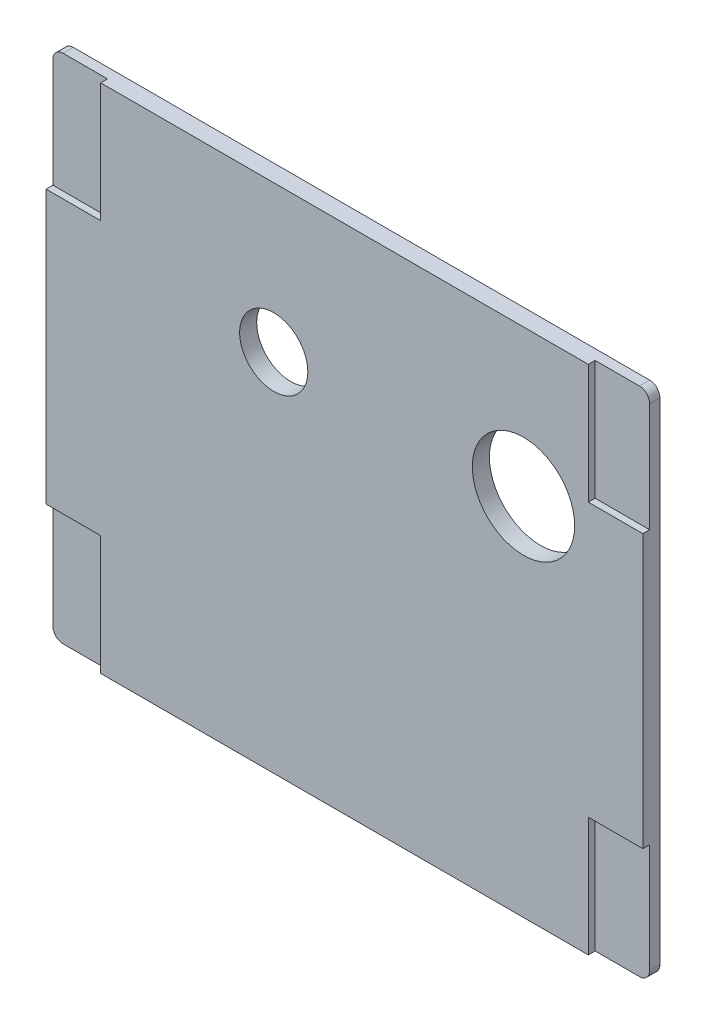
ISO-10303-21;
HEADER;
FILE_DESCRIPTION(('STEP AP214'),'2;1');
FILE_NAME('part.step','',(''),(''),'','','');
FILE_SCHEMA(('AUTOMOTIVE_DESIGN { 1 0 10303 214 1 1 1 1 }'));
ENDSEC;
DATA;
#1=APPLICATION_CONTEXT('core data for automotive mechanical design processes');
#2=APPLICATION_PROTOCOL_DEFINITION('international standard','automotive_design',2000,#1);
#3=PRODUCT_CONTEXT('',#1,'mechanical');
#4=PRODUCT('Part','Part','',(#3));
#5=PRODUCT_RELATED_PRODUCT_CATEGORY('part','',(#4));
#6=PRODUCT_DEFINITION_FORMATION('','',#4);
#7=PRODUCT_DEFINITION_CONTEXT('part definition',#1,'design');
#8=PRODUCT_DEFINITION('design','',#6,#7);
#9=PRODUCT_DEFINITION_SHAPE('','',#8);
#10=(LENGTH_UNIT() NAMED_UNIT(*) SI_UNIT(.MILLI.,.METRE.));
#11=(NAMED_UNIT(*) PLANE_ANGLE_UNIT() SI_UNIT($,.RADIAN.));
#12=(NAMED_UNIT(*) SI_UNIT($,.STERADIAN.) SOLID_ANGLE_UNIT());
#13=UNCERTAINTY_MEASURE_WITH_UNIT(LENGTH_MEASURE(1.E-05),#10,'distance_accuracy_value','');
#14=(GEOMETRIC_REPRESENTATION_CONTEXT(3) GLOBAL_UNCERTAINTY_ASSIGNED_CONTEXT((#13)) GLOBAL_UNIT_ASSIGNED_CONTEXT((#10,
#11,#12)) REPRESENTATION_CONTEXT('',''));
#15=CARTESIAN_POINT('',(0.,0.,0.));
#16=DIRECTION('',(0.,0.,1.));
#17=DIRECTION('',(1.,0.,0.));
#18=AXIS2_PLACEMENT_3D('',#15,#16,#17);
#19=CARTESIAN_POINT('',(0.,0.,5.));
#20=DIRECTION('',(-1.,0.,0.));
#21=DIRECTION('',(0.,-1.,0.));
#22=AXIS2_PLACEMENT_3D('',#19,#20,#21);
#23=PLANE('',#22);
#24=DIRECTION('',(0.,1.,0.));
#25=VECTOR('',#24,1.);
#26=CARTESIAN_POINT('',(0.,-150.,3.));
#27=LINE('',#26,#25);
#28=CARTESIAN_POINT('',(0.,-147.,3.));
#29=VERTEX_POINT('',#28);
#30=CARTESIAN_POINT('',(0.,-115.,3.));
#31=VERTEX_POINT('',#30);
#32=EDGE_CURVE('E204',#29,#31,#27,.T.);
#33=ORIENTED_EDGE('',*,*,#32,.F.);
#34=DIRECTION('',(0.,0.,-1.));
#35=VECTOR('',#34,1.);
#36=CARTESIAN_POINT('',(0.,-147.,5.));
#37=LINE('',#36,#35);
#38=CARTESIAN_POINT('',(0.,-147.,0.));
#39=VERTEX_POINT('',#38);
#40=EDGE_CURVE('E331',#29,#39,#37,.T.);
#41=ORIENTED_EDGE('',*,*,#40,.T.);
#42=DIRECTION('',(0.,1.,0.));
#43=VECTOR('',#42,1.);
#44=CARTESIAN_POINT('',(0.,0.,0.));
#45=LINE('',#44,#43);
#46=CARTESIAN_POINT('',(0.,-3.,0.));
#47=VERTEX_POINT('',#46);
#48=EDGE_CURVE('E280',#39,#47,#45,.T.);
#49=ORIENTED_EDGE('',*,*,#48,.T.);
#50=DIRECTION('',(0.,0.,-1.));
#51=VECTOR('',#50,1.);
#52=CARTESIAN_POINT('',(0.,-3.,5.));
#53=LINE('',#52,#51);
#54=CARTESIAN_POINT('',(0.,-3.,3.));
#55=VERTEX_POINT('',#54);
#56=EDGE_CURVE('E48',#47,#55,#53,.F.);
#57=ORIENTED_EDGE('',*,*,#56,.T.);
#58=DIRECTION('',(0.,1.,0.));
#59=VECTOR('',#58,1.);
#60=CARTESIAN_POINT('',(0.,0.,3.));
#61=LINE('',#60,#59);
#62=CARTESIAN_POINT('',(0.,-35.,3.));
#63=VERTEX_POINT('',#62);
#64=EDGE_CURVE('E182',#63,#55,#61,.T.);
#65=ORIENTED_EDGE('',*,*,#64,.F.);
#66=DIRECTION('',(0.,0.,1.));
#67=VECTOR('',#66,1.);
#68=CARTESIAN_POINT('',(0.,-35.,3.));
#69=LINE('',#68,#67);
#70=CARTESIAN_POINT('',(0.,-35.,5.));
#71=VERTEX_POINT('',#70);
#72=EDGE_CURVE('E199',#63,#71,#69,.T.);
#73=ORIENTED_EDGE('',*,*,#72,.T.);
#74=DIRECTION('',(0.,1.,0.));
#75=VECTOR('',#74,1.);
#76=CARTESIAN_POINT('',(0.,0.,5.));
#77=LINE('',#76,#75);
#78=CARTESIAN_POINT('',(0.,-115.,5.));
#79=VERTEX_POINT('',#78);
#80=EDGE_CURVE('E285',#79,#71,#77,.T.);
#81=ORIENTED_EDGE('',*,*,#80,.F.);
#82=DIRECTION('',(0.,0.,1.));
#83=VECTOR('',#82,1.);
#84=CARTESIAN_POINT('',(0.,-115.,3.));
#85=LINE('',#84,#83);
#86=EDGE_CURVE('E215',#31,#79,#85,.T.);
#87=ORIENTED_EDGE('',*,*,#86,.F.);
#88=EDGE_LOOP('',(#33,#41,#49,#57,#65,#73,#81,#87));
#89=FACE_BOUND('',#88,.T.);
#90=ADVANCED_FACE('F33',(#89),#23,.F.);
#91=CARTESIAN_POINT('',(0.,0.,5.));
#92=DIRECTION('',(0.,-1.,0.));
#93=DIRECTION('',(1.,0.,0.));
#94=AXIS2_PLACEMENT_3D('',#91,#92,#93);
#95=PLANE('',#94);
#96=DIRECTION('',(-1.,0.,0.));
#97=VECTOR('',#96,1.);
#98=CARTESIAN_POINT('',(0.,0.,0.));
#99=LINE('',#98,#97);
#100=CARTESIAN_POINT('',(-3.,0.,0.));
#101=VERTEX_POINT('',#100);
#102=CARTESIAN_POINT('',(-172.,0.,0.));
#103=VERTEX_POINT('',#102);
#104=EDGE_CURVE('E298',#101,#103,#99,.T.);
#105=ORIENTED_EDGE('',*,*,#104,.T.);
#106=DIRECTION('',(0.,0.,-1.));
#107=VECTOR('',#106,1.);
#108=CARTESIAN_POINT('',(-172.,0.,5.));
#109=LINE('',#108,#107);
#110=CARTESIAN_POINT('',(-172.,0.,3.));
#111=VERTEX_POINT('',#110);
#112=EDGE_CURVE('E319',#103,#111,#109,.F.);
#113=ORIENTED_EDGE('',*,*,#112,.T.);
#114=DIRECTION('',(-1.,0.,0.));
#115=VECTOR('',#114,1.);
#116=CARTESIAN_POINT('',(-175.,0.,3.));
#117=LINE('',#116,#115);
#118=CARTESIAN_POINT('',(-159.,0.,3.));
#119=VERTEX_POINT('',#118);
#120=EDGE_CURVE('E259',#119,#111,#117,.T.);
#121=ORIENTED_EDGE('',*,*,#120,.F.);
#122=DIRECTION('',(0.,0.,1.));
#123=VECTOR('',#122,1.);
#124=CARTESIAN_POINT('',(-159.,0.,3.));
#125=LINE('',#124,#123);
#126=CARTESIAN_POINT('',(-159.,0.,5.));
#127=VERTEX_POINT('',#126);
#128=EDGE_CURVE('E267',#119,#127,#125,.T.);
#129=ORIENTED_EDGE('',*,*,#128,.T.);
#130=DIRECTION('',(-1.,0.,0.));
#131=VECTOR('',#130,1.);
#132=CARTESIAN_POINT('',(0.,0.,5.));
#133=LINE('',#132,#131);
#134=CARTESIAN_POINT('',(-16.,0.,5.));
#135=VERTEX_POINT('',#134);
#136=EDGE_CURVE('E197',#135,#127,#133,.T.);
#137=ORIENTED_EDGE('',*,*,#136,.F.);
#138=DIRECTION('',(0.,0.,1.));
#139=VECTOR('',#138,1.);
#140=CARTESIAN_POINT('',(-16.,0.,3.));
#141=LINE('',#140,#139);
#142=CARTESIAN_POINT('',(-16.,0.,3.));
#143=VERTEX_POINT('',#142);
#144=EDGE_CURVE('E187',#143,#135,#141,.T.);
#145=ORIENTED_EDGE('',*,*,#144,.F.);
#146=DIRECTION('',(-1.,0.,0.));
#147=VECTOR('',#146,1.);
#148=CARTESIAN_POINT('',(0.,0.,3.));
#149=LINE('',#148,#147);
#150=CARTESIAN_POINT('',(-3.,0.,3.));
#151=VERTEX_POINT('',#150);
#152=EDGE_CURVE('E171',#151,#143,#149,.T.);
#153=ORIENTED_EDGE('',*,*,#152,.F.);
#154=DIRECTION('',(0.,0.,-1.));
#155=VECTOR('',#154,1.);
#156=CARTESIAN_POINT('',(-3.,0.,5.));
#157=LINE('',#156,#155);
#158=EDGE_CURVE('E317',#151,#101,#157,.T.);
#159=ORIENTED_EDGE('',*,*,#158,.T.);
#160=EDGE_LOOP('',(#105,#113,#121,#129,#137,#145,#153,#159));
#161=FACE_BOUND('',#160,.T.);
#162=ADVANCED_FACE('F194',(#161),#95,.F.);
#163=CARTESIAN_POINT('',(-175.,0.,5.));
#164=DIRECTION('',(1.,0.,0.));
#165=DIRECTION('',(0.,0.,-1.));
#166=AXIS2_PLACEMENT_3D('',#163,#164,#165);
#167=PLANE('',#166);
#168=DIRECTION('',(0.,-1.,0.));
#169=VECTOR('',#168,1.);
#170=CARTESIAN_POINT('',(-175.,0.,3.));
#171=LINE('',#170,#169);
#172=CARTESIAN_POINT('',(-175.,-3.00000000000002,3.));
#173=VERTEX_POINT('',#172);
#174=CARTESIAN_POINT('',(-175.,-35.,3.));
#175=VERTEX_POINT('',#174);
#176=EDGE_CURVE('E250',#173,#175,#171,.T.);
#177=ORIENTED_EDGE('',*,*,#176,.F.);
#178=DIRECTION('',(0.,0.,-1.));
#179=VECTOR('',#178,1.);
#180=CARTESIAN_POINT('',(-175.,-3.00000000000002,5.));
#181=LINE('',#180,#179);
#182=CARTESIAN_POINT('',(-175.,-3.00000000000002,0.));
#183=VERTEX_POINT('',#182);
#184=EDGE_CURVE('E306',#173,#183,#181,.T.);
#185=ORIENTED_EDGE('',*,*,#184,.T.);
#186=DIRECTION('',(0.,-1.,0.));
#187=VECTOR('',#186,1.);
#188=CARTESIAN_POINT('',(-175.,0.,0.));
#189=LINE('',#188,#187);
#190=CARTESIAN_POINT('',(-175.,-147.,0.));
#191=VERTEX_POINT('',#190);
#192=EDGE_CURVE('E300',#183,#191,#189,.T.);
#193=ORIENTED_EDGE('',*,*,#192,.T.);
#194=DIRECTION('',(0.,0.,-1.));
#195=VECTOR('',#194,1.);
#196=CARTESIAN_POINT('',(-175.,-147.,5.));
#197=LINE('',#196,#195);
#198=CARTESIAN_POINT('',(-175.,-147.,3.));
#199=VERTEX_POINT('',#198);
#200=EDGE_CURVE('E296',#191,#199,#197,.F.);
#201=ORIENTED_EDGE('',*,*,#200,.T.);
#202=DIRECTION('',(0.,-1.,0.));
#203=VECTOR('',#202,1.);
#204=CARTESIAN_POINT('',(-175.,-150.,3.));
#205=LINE('',#204,#203);
#206=CARTESIAN_POINT('',(-175.,-115.,3.));
#207=VERTEX_POINT('',#206);
#208=EDGE_CURVE('E228',#207,#199,#205,.T.);
#209=ORIENTED_EDGE('',*,*,#208,.F.);
#210=DIRECTION('',(0.,0.,1.));
#211=VECTOR('',#210,1.);
#212=CARTESIAN_POINT('',(-175.,-115.,3.));
#213=LINE('',#212,#211);
#214=CARTESIAN_POINT('',(-175.,-115.,5.));
#215=VERTEX_POINT('',#214);
#216=EDGE_CURVE('E219',#207,#215,#213,.T.);
#217=ORIENTED_EDGE('',*,*,#216,.T.);
#218=DIRECTION('',(0.,-1.,0.));
#219=VECTOR('',#218,1.);
#220=CARTESIAN_POINT('',(-175.,0.,5.));
#221=LINE('',#220,#219);
#222=CARTESIAN_POINT('',(-175.,-35.,5.));
#223=VERTEX_POINT('',#222);
#224=EDGE_CURVE('E290',#223,#215,#221,.T.);
#225=ORIENTED_EDGE('',*,*,#224,.F.);
#226=DIRECTION('',(0.,0.,1.));
#227=VECTOR('',#226,1.);
#228=CARTESIAN_POINT('',(-175.,-35.,3.));
#229=LINE('',#228,#227);
#230=EDGE_CURVE('E262',#175,#223,#229,.T.);
#231=ORIENTED_EDGE('',*,*,#230,.F.);
#232=EDGE_LOOP('',(#177,#185,#193,#201,#209,#217,#225,#231));
#233=FACE_BOUND('',#232,.T.);
#234=ADVANCED_FACE('F355',(#233),#167,.F.);
#235=CARTESIAN_POINT('',(0.,-150.,5.));
#236=DIRECTION('',(0.,1.,0.));
#237=DIRECTION('',(-1.,0.,0.));
#238=AXIS2_PLACEMENT_3D('',#235,#236,#237);
#239=PLANE('',#238);
#240=DIRECTION('',(1.,0.,0.));
#241=VECTOR('',#240,1.);
#242=CARTESIAN_POINT('',(-175.,-150.,3.));
#243=LINE('',#242,#241);
#244=CARTESIAN_POINT('',(-172.,-150.,3.));
#245=VERTEX_POINT('',#244);
#246=CARTESIAN_POINT('',(-159.,-150.,3.));
#247=VERTEX_POINT('',#246);
#248=EDGE_CURVE('E231',#245,#247,#243,.T.);
#249=ORIENTED_EDGE('',*,*,#248,.F.);
#250=DIRECTION('',(0.,0.,-1.));
#251=VECTOR('',#250,1.);
#252=CARTESIAN_POINT('',(-172.,-150.,5.));
#253=LINE('',#252,#251);
#254=CARTESIAN_POINT('',(-172.,-150.,0.));
#255=VERTEX_POINT('',#254);
#256=EDGE_CURVE('E325',#245,#255,#253,.T.);
#257=ORIENTED_EDGE('',*,*,#256,.T.);
#258=DIRECTION('',(1.,0.,0.));
#259=VECTOR('',#258,1.);
#260=CARTESIAN_POINT('',(0.,-150.,0.));
#261=LINE('',#260,#259);
#262=CARTESIAN_POINT('',(-2.99999999999998,-150.,0.));
#263=VERTEX_POINT('',#262);
#264=EDGE_CURVE('E288',#255,#263,#261,.T.);
#265=ORIENTED_EDGE('',*,*,#264,.T.);
#266=DIRECTION('',(0.,0.,-1.));
#267=VECTOR('',#266,1.);
#268=CARTESIAN_POINT('',(-2.99999999999998,-150.,5.));
#269=LINE('',#268,#267);
#270=CARTESIAN_POINT('',(-2.99999999999998,-150.,3.));
#271=VERTEX_POINT('',#270);
#272=EDGE_CURVE('E323',#263,#271,#269,.F.);
#273=ORIENTED_EDGE('',*,*,#272,.T.);
#274=DIRECTION('',(1.,0.,0.));
#275=VECTOR('',#274,1.);
#276=CARTESIAN_POINT('',(0.,-150.,3.));
#277=LINE('',#276,#275);
#278=CARTESIAN_POINT('',(-16.,-150.,3.));
#279=VERTEX_POINT('',#278);
#280=EDGE_CURVE('E213',#279,#271,#277,.T.);
#281=ORIENTED_EDGE('',*,*,#280,.F.);
#282=DIRECTION('',(0.,0.,1.));
#283=VECTOR('',#282,1.);
#284=CARTESIAN_POINT('',(-16.,-150.,3.));
#285=LINE('',#284,#283);
#286=CARTESIAN_POINT('',(-16.,-150.,5.));
#287=VERTEX_POINT('',#286);
#288=EDGE_CURVE('E221',#279,#287,#285,.T.);
#289=ORIENTED_EDGE('',*,*,#288,.T.);
#290=DIRECTION('',(1.,0.,0.));
#291=VECTOR('',#290,1.);
#292=CARTESIAN_POINT('',(0.,-150.,5.));
#293=LINE('',#292,#291);
#294=CARTESIAN_POINT('',(-159.,-150.,5.));
#295=VERTEX_POINT('',#294);
#296=EDGE_CURVE('E293',#295,#287,#293,.T.);
#297=ORIENTED_EDGE('',*,*,#296,.F.);
#298=DIRECTION('',(0.,0.,1.));
#299=VECTOR('',#298,1.);
#300=CARTESIAN_POINT('',(-159.,-150.,3.));
#301=LINE('',#300,#299);
#302=EDGE_CURVE('E240',#247,#295,#301,.T.);
#303=ORIENTED_EDGE('',*,*,#302,.F.);
#304=EDGE_LOOP('',(#249,#257,#265,#273,#281,#289,#297,#303));
#305=FACE_BOUND('',#304,.T.);
#306=ADVANCED_FACE('F402',(#305),#239,.F.);
#307=CARTESIAN_POINT('',(0.,0.,5.));
#308=DIRECTION('',(0.,0.,-1.));
#309=DIRECTION('',(-1.,0.,0.));
#310=AXIS2_PLACEMENT_3D('',#307,#308,#309);
#311=PLANE('',#310);
#312=CARTESIAN_POINT('',(-35.,-43.,5.));
#313=DIRECTION('',(0.,0.,1.));
#314=DIRECTION('',(1.,0.,0.));
#315=AXIS2_PLACEMENT_3D('',#312,#313,#314);
#316=CIRCLE('',#315,15.);
#317=CARTESIAN_POINT('',(-20.,-43.,5.));
#318=VERTEX_POINT('',#317);
#319=EDGE_CURVE('E273',#318,#318,#316,.T.);
#320=ORIENTED_EDGE('',*,*,#319,.F.);
#321=EDGE_LOOP('',(#320));
#322=FACE_BOUND('',#321,.T.);
#323=CARTESIAN_POINT('',(-108.25,-43.,5.));
#324=DIRECTION('',(0.,0.,1.));
#325=DIRECTION('',(1.,0.,0.));
#326=AXIS2_PLACEMENT_3D('',#323,#324,#325);
#327=CIRCLE('',#326,9.99999999999999);
#328=CARTESIAN_POINT('',(-98.25,-43.,5.));
#329=VERTEX_POINT('',#328);
#330=EDGE_CURVE('E269',#329,#329,#327,.T.);
#331=ORIENTED_EDGE('',*,*,#330,.F.);
#332=EDGE_LOOP('',(#331));
#333=FACE_BOUND('',#332,.T.);
#334=ORIENTED_EDGE('',*,*,#224,.T.);
#335=DIRECTION('',(-1.,0.,0.));
#336=VECTOR('',#335,1.);
#337=CARTESIAN_POINT('',(-175.,-115.,5.));
#338=LINE('',#337,#336);
#339=CARTESIAN_POINT('',(-159.,-115.,5.));
#340=VERTEX_POINT('',#339);
#341=EDGE_CURVE('E232',#340,#215,#338,.T.);
#342=ORIENTED_EDGE('',*,*,#341,.F.);
#343=DIRECTION('',(0.,1.,0.));
#344=VECTOR('',#343,1.);
#345=CARTESIAN_POINT('',(-159.,-150.,5.));
#346=LINE('',#345,#344);
#347=EDGE_CURVE('E241',#295,#340,#346,.T.);
#348=ORIENTED_EDGE('',*,*,#347,.F.);
#349=ORIENTED_EDGE('',*,*,#296,.T.);
#350=DIRECTION('',(0.,-1.,0.));
#351=VECTOR('',#350,1.);
#352=CARTESIAN_POINT('',(-16.,-150.,5.));
#353=LINE('',#352,#351);
#354=CARTESIAN_POINT('',(-16.,-115.,5.));
#355=VERTEX_POINT('',#354);
#356=EDGE_CURVE('E207',#355,#287,#353,.T.);
#357=ORIENTED_EDGE('',*,*,#356,.F.);
#358=DIRECTION('',(-1.,0.,0.));
#359=VECTOR('',#358,1.);
#360=CARTESIAN_POINT('',(0.,-115.,5.));
#361=LINE('',#360,#359);
#362=EDGE_CURVE('E216',#79,#355,#361,.T.);
#363=ORIENTED_EDGE('',*,*,#362,.F.);
#364=ORIENTED_EDGE('',*,*,#80,.T.);
#365=DIRECTION('',(1.,0.,0.));
#366=VECTOR('',#365,1.);
#367=CARTESIAN_POINT('',(0.,-35.,5.));
#368=LINE('',#367,#366);
#369=CARTESIAN_POINT('',(-16.,-35.,5.));
#370=VERTEX_POINT('',#369);
#371=EDGE_CURVE('E457',#370,#71,#368,.T.);
#372=ORIENTED_EDGE('',*,*,#371,.F.);
#373=DIRECTION('',(0.,-1.,0.));
#374=VECTOR('',#373,1.);
#375=CARTESIAN_POINT('',(-16.,0.,5.));
#376=LINE('',#375,#374);
#377=EDGE_CURVE('E224',#135,#370,#376,.T.);
#378=ORIENTED_EDGE('',*,*,#377,.F.);
#379=ORIENTED_EDGE('',*,*,#136,.T.);
#380=DIRECTION('',(0.,1.,0.));
#381=VECTOR('',#380,1.);
#382=CARTESIAN_POINT('',(-159.,0.,5.));
#383=LINE('',#382,#381);
#384=CARTESIAN_POINT('',(-159.,-35.,5.));
#385=VERTEX_POINT('',#384);
#386=EDGE_CURVE('E253',#385,#127,#383,.T.);
#387=ORIENTED_EDGE('',*,*,#386,.F.);
#388=DIRECTION('',(1.,0.,0.));
#389=VECTOR('',#388,1.);
#390=CARTESIAN_POINT('',(-175.,-35.,5.));
#391=LINE('',#390,#389);
#392=EDGE_CURVE('E263',#223,#385,#391,.T.);
#393=ORIENTED_EDGE('',*,*,#392,.F.);
#394=EDGE_LOOP('',(#334,#342,#348,#349,#357,#363,#364,#372,#378,#379,#387,#393));
#395=FACE_BOUND('',#394,.T.);
#396=ADVANCED_FACE('F362',(#322,#333,#395),#311,.F.);
#397=CARTESIAN_POINT('',(0.,0.,0.));
#398=DIRECTION('',(0.,0.,-1.));
#399=DIRECTION('',(-1.,0.,0.));
#400=AXIS2_PLACEMENT_3D('',#397,#398,#399);
#401=PLANE('',#400);
#402=CARTESIAN_POINT('',(-35.,-43.,0.));
#403=DIRECTION('',(0.,0.,-1.));
#404=DIRECTION('',(-1.,0.,0.));
#405=AXIS2_PLACEMENT_3D('',#402,#403,#404);
#406=CIRCLE('',#405,15.);
#407=CARTESIAN_POINT('',(-50.,-43.,0.));
#408=VERTEX_POINT('',#407);
#409=EDGE_CURVE('E276',#408,#408,#406,.F.);
#410=ORIENTED_EDGE('',*,*,#409,.T.);
#411=EDGE_LOOP('',(#410));
#412=FACE_BOUND('',#411,.T.);
#413=CARTESIAN_POINT('',(-108.25,-43.,0.));
#414=DIRECTION('',(0.,0.,-1.));
#415=DIRECTION('',(-1.,0.,0.));
#416=AXIS2_PLACEMENT_3D('',#413,#414,#415);
#417=CIRCLE('',#416,9.99999999999999);
#418=CARTESIAN_POINT('',(-118.25,-43.,0.));
#419=VERTEX_POINT('',#418);
#420=EDGE_CURVE('E277',#419,#419,#417,.F.);
#421=ORIENTED_EDGE('',*,*,#420,.T.);
#422=EDGE_LOOP('',(#421));
#423=FACE_BOUND('',#422,.T.);
#424=ORIENTED_EDGE('',*,*,#192,.F.);
#425=CARTESIAN_POINT('',(-172.,-3.00000000000002,0.));
#426=DIRECTION('',(0.,0.,-1.));
#427=DIRECTION('',(-1.,0.,0.));
#428=AXIS2_PLACEMENT_3D('',#425,#426,#427);
#429=CIRCLE('',#428,3.);
#430=EDGE_CURVE('E315',#183,#103,#429,.T.);
#431=ORIENTED_EDGE('',*,*,#430,.T.);
#432=ORIENTED_EDGE('',*,*,#104,.F.);
#433=CARTESIAN_POINT('',(-3.,-3.,0.));
#434=DIRECTION('',(0.,0.,-1.));
#435=DIRECTION('',(-1.,0.,0.));
#436=AXIS2_PLACEMENT_3D('',#433,#434,#435);
#437=CIRCLE('',#436,3.);
#438=EDGE_CURVE('E309',#101,#47,#437,.T.);
#439=ORIENTED_EDGE('',*,*,#438,.T.);
#440=ORIENTED_EDGE('',*,*,#48,.F.);
#441=CARTESIAN_POINT('',(-2.99999999999998,-147.,0.));
#442=DIRECTION('',(0.,0.,-1.));
#443=DIRECTION('',(-1.,0.,0.));
#444=AXIS2_PLACEMENT_3D('',#441,#442,#443);
#445=CIRCLE('',#444,3.);
#446=EDGE_CURVE('E311',#39,#263,#445,.T.);
#447=ORIENTED_EDGE('',*,*,#446,.T.);
#448=ORIENTED_EDGE('',*,*,#264,.F.);
#449=CARTESIAN_POINT('',(-172.,-147.,0.));
#450=DIRECTION('',(0.,0.,-1.));
#451=DIRECTION('',(-1.,0.,0.));
#452=AXIS2_PLACEMENT_3D('',#449,#450,#451);
#453=CIRCLE('',#452,3.);
#454=EDGE_CURVE('E313',#255,#191,#453,.T.);
#455=ORIENTED_EDGE('',*,*,#454,.T.);
#456=EDGE_LOOP('',(#424,#431,#432,#439,#440,#447,#448,#455));
#457=FACE_BOUND('',#456,.T.);
#458=ADVANCED_FACE('F339',(#412,#423,#457),#401,.T.);
#459=CARTESIAN_POINT('',(-108.25,-43.,-42.4264068711929));
#460=DIRECTION('',(0.,0.,1.));
#461=DIRECTION('',(1.,0.,0.));
#462=AXIS2_PLACEMENT_3D('',#459,#460,#461);
#463=CYLINDRICAL_SURFACE('',#462,9.99999999999999);
#464=ORIENTED_EDGE('',*,*,#330,.T.);
#465=EDGE_LOOP('',(#464));
#466=FACE_BOUND('',#465,.T.);
#467=ORIENTED_EDGE('',*,*,#420,.F.);
#468=EDGE_LOOP('',(#467));
#469=FACE_BOUND('',#468,.T.);
#470=ADVANCED_FACE('F375',(#466,#469),#463,.F.);
#471=CARTESIAN_POINT('',(-35.,-43.,-42.4264068711929));
#472=DIRECTION('',(0.,0.,1.));
#473=DIRECTION('',(1.,0.,0.));
#474=AXIS2_PLACEMENT_3D('',#471,#472,#473);
#475=CYLINDRICAL_SURFACE('',#474,15.);
#476=ORIENTED_EDGE('',*,*,#319,.T.);
#477=EDGE_LOOP('',(#476));
#478=FACE_BOUND('',#477,.T.);
#479=ORIENTED_EDGE('',*,*,#409,.F.);
#480=EDGE_LOOP('',(#479));
#481=FACE_BOUND('',#480,.T.);
#482=ADVANCED_FACE('F368',(#478,#481),#475,.F.);
#483=CARTESIAN_POINT('',(-159.,0.,3.));
#484=DIRECTION('',(1.,0.,0.));
#485=DIRECTION('',(0.,0.,-1.));
#486=AXIS2_PLACEMENT_3D('',#483,#484,#485);
#487=PLANE('',#486);
#488=ORIENTED_EDGE('',*,*,#386,.T.);
#489=ORIENTED_EDGE('',*,*,#128,.F.);
#490=DIRECTION('',(0.,1.,0.));
#491=VECTOR('',#490,1.);
#492=CARTESIAN_POINT('',(-159.,0.,3.));
#493=LINE('',#492,#491);
#494=CARTESIAN_POINT('',(-159.,-35.,3.));
#495=VERTEX_POINT('',#494);
#496=EDGE_CURVE('E256',#495,#119,#493,.T.);
#497=ORIENTED_EDGE('',*,*,#496,.F.);
#498=DIRECTION('',(0.,0.,1.));
#499=VECTOR('',#498,1.);
#500=CARTESIAN_POINT('',(-159.,-35.,3.));
#501=LINE('',#500,#499);
#502=EDGE_CURVE('E270',#495,#385,#501,.T.);
#503=ORIENTED_EDGE('',*,*,#502,.T.);
#504=EDGE_LOOP('',(#488,#489,#497,#503));
#505=FACE_BOUND('',#504,.T.);
#506=ADVANCED_FACE('F365',(#505),#487,.F.);
#507=CARTESIAN_POINT('',(-175.,-35.,3.));
#508=DIRECTION('',(0.,-1.,0.));
#509=DIRECTION('',(0.,0.,-1.));
#510=AXIS2_PLACEMENT_3D('',#507,#508,#509);
#511=PLANE('',#510);
#512=ORIENTED_EDGE('',*,*,#392,.T.);
#513=ORIENTED_EDGE('',*,*,#502,.F.);
#514=DIRECTION('',(1.,0.,0.));
#515=VECTOR('',#514,1.);
#516=CARTESIAN_POINT('',(-175.,-35.,3.));
#517=LINE('',#516,#515);
#518=EDGE_CURVE('E252',#175,#495,#517,.T.);
#519=ORIENTED_EDGE('',*,*,#518,.F.);
#520=ORIENTED_EDGE('',*,*,#230,.T.);
#521=EDGE_LOOP('',(#512,#513,#519,#520));
#522=FACE_BOUND('',#521,.T.);
#523=ADVANCED_FACE('F359',(#522),#511,.F.);
#524=CARTESIAN_POINT('',(0.,0.,3.));
#525=DIRECTION('',(0.,0.,1.));
#526=DIRECTION('',(1.,0.,0.));
#527=AXIS2_PLACEMENT_3D('',#524,#525,#526);
#528=PLANE('',#527);
#529=ORIENTED_EDGE('',*,*,#120,.T.);
#530=CARTESIAN_POINT('',(-172.,-3.00000000000002,3.));
#531=DIRECTION('',(0.,0.,1.));
#532=DIRECTION('',(1.,0.,0.));
#533=AXIS2_PLACEMENT_3D('',#530,#531,#532);
#534=CIRCLE('',#533,3.);
#535=EDGE_CURVE('E321',#111,#173,#534,.T.);
#536=ORIENTED_EDGE('',*,*,#535,.T.);
#537=ORIENTED_EDGE('',*,*,#176,.T.);
#538=ORIENTED_EDGE('',*,*,#518,.T.);
#539=ORIENTED_EDGE('',*,*,#496,.T.);
#540=EDGE_LOOP('',(#529,#536,#537,#538,#539));
#541=FACE_BOUND('',#540,.T.);
#542=ADVANCED_FACE('F351',(#541),#528,.T.);
#543=CARTESIAN_POINT('',(0.,-35.,3.));
#544=DIRECTION('',(0.,-1.,0.));
#545=DIRECTION('',(0.,0.,-1.));
#546=AXIS2_PLACEMENT_3D('',#543,#544,#545);
#547=PLANE('',#546);
#548=ORIENTED_EDGE('',*,*,#371,.T.);
#549=ORIENTED_EDGE('',*,*,#72,.F.);
#550=DIRECTION('',(1.,0.,0.));
#551=VECTOR('',#550,1.);
#552=CARTESIAN_POINT('',(0.,-35.,3.));
#553=LINE('',#552,#551);
#554=CARTESIAN_POINT('',(-16.,-35.,3.));
#555=VERTEX_POINT('',#554);
#556=EDGE_CURVE('E190',#555,#63,#553,.T.);
#557=ORIENTED_EDGE('',*,*,#556,.F.);
#558=DIRECTION('',(0.,0.,1.));
#559=VECTOR('',#558,1.);
#560=CARTESIAN_POINT('',(-16.,-35.,3.));
#561=LINE('',#560,#559);
#562=EDGE_CURVE('E189',#555,#370,#561,.T.);
#563=ORIENTED_EDGE('',*,*,#562,.T.);
#564=EDGE_LOOP('',(#548,#549,#557,#563));
#565=FACE_BOUND('',#564,.T.);
#566=ADVANCED_FACE('F436',(#565),#547,.F.);
#567=CARTESIAN_POINT('',(-16.,0.,3.));
#568=DIRECTION('',(-1.,0.,0.));
#569=DIRECTION('',(0.,-1.,0.));
#570=AXIS2_PLACEMENT_3D('',#567,#568,#569);
#571=PLANE('',#570);
#572=ORIENTED_EDGE('',*,*,#377,.T.);
#573=ORIENTED_EDGE('',*,*,#562,.F.);
#574=DIRECTION('',(0.,-1.,0.));
#575=VECTOR('',#574,1.);
#576=CARTESIAN_POINT('',(-16.,0.,3.));
#577=LINE('',#576,#575);
#578=EDGE_CURVE('E175',#143,#555,#577,.T.);
#579=ORIENTED_EDGE('',*,*,#578,.F.);
#580=ORIENTED_EDGE('',*,*,#144,.T.);
#581=EDGE_LOOP('',(#572,#573,#579,#580));
#582=FACE_BOUND('',#581,.T.);
#583=ADVANCED_FACE('F186',(#582),#571,.F.);
#584=CARTESIAN_POINT('',(0.,0.,3.));
#585=DIRECTION('',(0.,0.,-1.));
#586=DIRECTION('',(-1.,0.,0.));
#587=AXIS2_PLACEMENT_3D('',#584,#585,#586);
#588=PLANE('',#587);
#589=ORIENTED_EDGE('',*,*,#64,.T.);
#590=CARTESIAN_POINT('',(-3.,-3.,3.));
#591=DIRECTION('',(0.,0.,-1.));
#592=DIRECTION('',(-1.,0.,0.));
#593=AXIS2_PLACEMENT_3D('',#590,#591,#592);
#594=CIRCLE('',#593,3.);
#595=EDGE_CURVE('E11',#55,#151,#594,.F.);
#596=ORIENTED_EDGE('',*,*,#595,.T.);
#597=ORIENTED_EDGE('',*,*,#152,.T.);
#598=ORIENTED_EDGE('',*,*,#578,.T.);
#599=ORIENTED_EDGE('',*,*,#556,.T.);
#600=EDGE_LOOP('',(#589,#596,#597,#598,#599));
#601=FACE_BOUND('',#600,.T.);
#602=ADVANCED_FACE('F173',(#601),#588,.F.);
#603=CARTESIAN_POINT('',(-16.,-150.,3.));
#604=DIRECTION('',(-1.,0.,0.));
#605=DIRECTION('',(0.,0.,1.));
#606=AXIS2_PLACEMENT_3D('',#603,#604,#605);
#607=PLANE('',#606);
#608=ORIENTED_EDGE('',*,*,#356,.T.);
#609=ORIENTED_EDGE('',*,*,#288,.F.);
#610=DIRECTION('',(0.,-1.,0.));
#611=VECTOR('',#610,1.);
#612=CARTESIAN_POINT('',(-16.,-150.,3.));
#613=LINE('',#612,#611);
#614=CARTESIAN_POINT('',(-16.,-115.,3.));
#615=VERTEX_POINT('',#614);
#616=EDGE_CURVE('E210',#615,#279,#613,.T.);
#617=ORIENTED_EDGE('',*,*,#616,.F.);
#618=DIRECTION('',(0.,0.,1.));
#619=VECTOR('',#618,1.);
#620=CARTESIAN_POINT('',(-16.,-115.,3.));
#621=LINE('',#620,#619);
#622=EDGE_CURVE('E225',#615,#355,#621,.T.);
#623=ORIENTED_EDGE('',*,*,#622,.T.);
#624=EDGE_LOOP('',(#608,#609,#617,#623));
#625=FACE_BOUND('',#624,.T.);
#626=ADVANCED_FACE('F407',(#625),#607,.F.);
#627=CARTESIAN_POINT('',(0.,-115.,3.));
#628=DIRECTION('',(0.,1.,0.));
#629=DIRECTION('',(0.,0.,1.));
#630=AXIS2_PLACEMENT_3D('',#627,#628,#629);
#631=PLANE('',#630);
#632=ORIENTED_EDGE('',*,*,#362,.T.);
#633=ORIENTED_EDGE('',*,*,#622,.F.);
#634=DIRECTION('',(-1.,0.,0.));
#635=VECTOR('',#634,1.);
#636=CARTESIAN_POINT('',(0.,-115.,3.));
#637=LINE('',#636,#635);
#638=EDGE_CURVE('E206',#31,#615,#637,.T.);
#639=ORIENTED_EDGE('',*,*,#638,.F.);
#640=ORIENTED_EDGE('',*,*,#86,.T.);
#641=EDGE_LOOP('',(#632,#633,#639,#640));
#642=FACE_BOUND('',#641,.T.);
#643=ADVANCED_FACE('F431',(#642),#631,.F.);
#644=CARTESIAN_POINT('',(0.,0.,3.));
#645=DIRECTION('',(0.,0.,1.));
#646=DIRECTION('',(1.,0.,0.));
#647=AXIS2_PLACEMENT_3D('',#644,#645,#646);
#648=PLANE('',#647);
#649=ORIENTED_EDGE('',*,*,#280,.T.);
#650=CARTESIAN_POINT('',(-2.99999999999998,-147.,3.));
#651=DIRECTION('',(0.,0.,1.));
#652=DIRECTION('',(1.,0.,0.));
#653=AXIS2_PLACEMENT_3D('',#650,#651,#652);
#654=CIRCLE('',#653,3.);
#655=EDGE_CURVE('E41',#271,#29,#654,.T.);
#656=ORIENTED_EDGE('',*,*,#655,.T.);
#657=ORIENTED_EDGE('',*,*,#32,.T.);
#658=ORIENTED_EDGE('',*,*,#638,.T.);
#659=ORIENTED_EDGE('',*,*,#616,.T.);
#660=EDGE_LOOP('',(#649,#656,#657,#658,#659));
#661=FACE_BOUND('',#660,.T.);
#662=ADVANCED_FACE('F403',(#661),#648,.T.);
#663=CARTESIAN_POINT('',(-175.,-115.,3.));
#664=DIRECTION('',(0.,1.,0.));
#665=DIRECTION('',(0.,0.,1.));
#666=AXIS2_PLACEMENT_3D('',#663,#664,#665);
#667=PLANE('',#666);
#668=ORIENTED_EDGE('',*,*,#341,.T.);
#669=ORIENTED_EDGE('',*,*,#216,.F.);
#670=DIRECTION('',(-1.,0.,0.));
#671=VECTOR('',#670,1.);
#672=CARTESIAN_POINT('',(-175.,-115.,3.));
#673=LINE('',#672,#671);
#674=CARTESIAN_POINT('',(-159.,-115.,3.));
#675=VERTEX_POINT('',#674);
#676=EDGE_CURVE('E237',#675,#207,#673,.T.);
#677=ORIENTED_EDGE('',*,*,#676,.F.);
#678=DIRECTION('',(0.,0.,1.));
#679=VECTOR('',#678,1.);
#680=CARTESIAN_POINT('',(-159.,-115.,3.));
#681=LINE('',#680,#679);
#682=EDGE_CURVE('E247',#675,#340,#681,.T.);
#683=ORIENTED_EDGE('',*,*,#682,.T.);
#684=EDGE_LOOP('',(#668,#669,#677,#683));
#685=FACE_BOUND('',#684,.T.);
#686=ADVANCED_FACE('F423',(#685),#667,.F.);
#687=CARTESIAN_POINT('',(-159.,-150.,3.));
#688=DIRECTION('',(1.,0.,0.));
#689=DIRECTION('',(0.,0.,-1.));
#690=AXIS2_PLACEMENT_3D('',#687,#688,#689);
#691=PLANE('',#690);
#692=ORIENTED_EDGE('',*,*,#347,.T.);
#693=ORIENTED_EDGE('',*,*,#682,.F.);
#694=DIRECTION('',(0.,1.,0.));
#695=VECTOR('',#694,1.);
#696=CARTESIAN_POINT('',(-159.,-150.,3.));
#697=LINE('',#696,#695);
#698=EDGE_CURVE('E234',#247,#675,#697,.T.);
#699=ORIENTED_EDGE('',*,*,#698,.F.);
#700=ORIENTED_EDGE('',*,*,#302,.T.);
#701=EDGE_LOOP('',(#692,#693,#699,#700));
#702=FACE_BOUND('',#701,.T.);
#703=ADVANCED_FACE('F414',(#702),#691,.F.);
#704=CARTESIAN_POINT('',(0.,0.,3.));
#705=DIRECTION('',(0.,0.,-1.));
#706=DIRECTION('',(-1.,0.,0.));
#707=AXIS2_PLACEMENT_3D('',#704,#705,#706);
#708=PLANE('',#707);
#709=ORIENTED_EDGE('',*,*,#208,.T.);
#710=CARTESIAN_POINT('',(-172.,-147.,3.));
#711=DIRECTION('',(0.,0.,-1.));
#712=DIRECTION('',(-1.,0.,0.));
#713=AXIS2_PLACEMENT_3D('',#710,#711,#712);
#714=CIRCLE('',#713,3.);
#715=EDGE_CURVE('E328',#199,#245,#714,.F.);
#716=ORIENTED_EDGE('',*,*,#715,.T.);
#717=ORIENTED_EDGE('',*,*,#248,.T.);
#718=ORIENTED_EDGE('',*,*,#698,.T.);
#719=ORIENTED_EDGE('',*,*,#676,.T.);
#720=EDGE_LOOP('',(#709,#716,#717,#718,#719));
#721=FACE_BOUND('',#720,.T.);
#722=ADVANCED_FACE('F390',(#721),#708,.F.);
#723=CARTESIAN_POINT('',(-172.,-3.00000000000002,5.));
#724=DIRECTION('',(0.,0.,-1.));
#725=DIRECTION('',(-1.,0.,0.));
#726=AXIS2_PLACEMENT_3D('',#723,#724,#725);
#727=CYLINDRICAL_SURFACE('',#726,3.);
#728=ORIENTED_EDGE('',*,*,#535,.F.);
#729=ORIENTED_EDGE('',*,*,#112,.F.);
#730=ORIENTED_EDGE('',*,*,#430,.F.);
#731=ORIENTED_EDGE('',*,*,#184,.F.);
#732=EDGE_LOOP('',(#728,#729,#730,#731));
#733=FACE_BOUND('',#732,.T.);
#734=ADVANCED_FACE('F347',(#733),#727,.T.);
#735=CARTESIAN_POINT('',(-172.,-147.,5.));
#736=DIRECTION('',(0.,0.,-1.));
#737=DIRECTION('',(-1.,0.,0.));
#738=AXIS2_PLACEMENT_3D('',#735,#736,#737);
#739=CYLINDRICAL_SURFACE('',#738,3.);
#740=ORIENTED_EDGE('',*,*,#715,.F.);
#741=ORIENTED_EDGE('',*,*,#200,.F.);
#742=ORIENTED_EDGE('',*,*,#454,.F.);
#743=ORIENTED_EDGE('',*,*,#256,.F.);
#744=EDGE_LOOP('',(#740,#741,#742,#743));
#745=FACE_BOUND('',#744,.T.);
#746=ADVANCED_FACE('F389',(#745),#739,.T.);
#747=CARTESIAN_POINT('',(-2.99999999999998,-147.,5.));
#748=DIRECTION('',(0.,0.,-1.));
#749=DIRECTION('',(-1.,0.,0.));
#750=AXIS2_PLACEMENT_3D('',#747,#748,#749);
#751=CYLINDRICAL_SURFACE('',#750,3.);
#752=ORIENTED_EDGE('',*,*,#655,.F.);
#753=ORIENTED_EDGE('',*,*,#272,.F.);
#754=ORIENTED_EDGE('',*,*,#446,.F.);
#755=ORIENTED_EDGE('',*,*,#40,.F.);
#756=EDGE_LOOP('',(#752,#753,#754,#755));
#757=FACE_BOUND('',#756,.T.);
#758=ADVANCED_FACE('F392',(#757),#751,.T.);
#759=CARTESIAN_POINT('',(-3.,-3.,5.));
#760=DIRECTION('',(0.,0.,-1.));
#761=DIRECTION('',(-1.,0.,0.));
#762=AXIS2_PLACEMENT_3D('',#759,#760,#761);
#763=CYLINDRICAL_SURFACE('',#762,3.);
#764=ORIENTED_EDGE('',*,*,#595,.F.);
#765=ORIENTED_EDGE('',*,*,#56,.F.);
#766=ORIENTED_EDGE('',*,*,#438,.F.);
#767=ORIENTED_EDGE('',*,*,#158,.F.);
#768=EDGE_LOOP('',(#764,#765,#766,#767));
#769=FACE_BOUND('',#768,.T.);
#770=ADVANCED_FACE('F35',(#769),#763,.T.);
#771=CLOSED_SHELL('',(#90,#162,#234,#306,#396,#458,#470,#482,#506,#523,#542,#566,#583,#602,#626,
#643,#662,#686,#703,#722,#734,#746,#758,#770));
#772=MANIFOLD_SOLID_BREP('B2',#771);
#773=ADVANCED_BREP_SHAPE_REPRESENTATION('',(#18,#772),#14);
#774=SHAPE_DEFINITION_REPRESENTATION(#9,#773);
ENDSEC;
END-ISO-10303-21;
